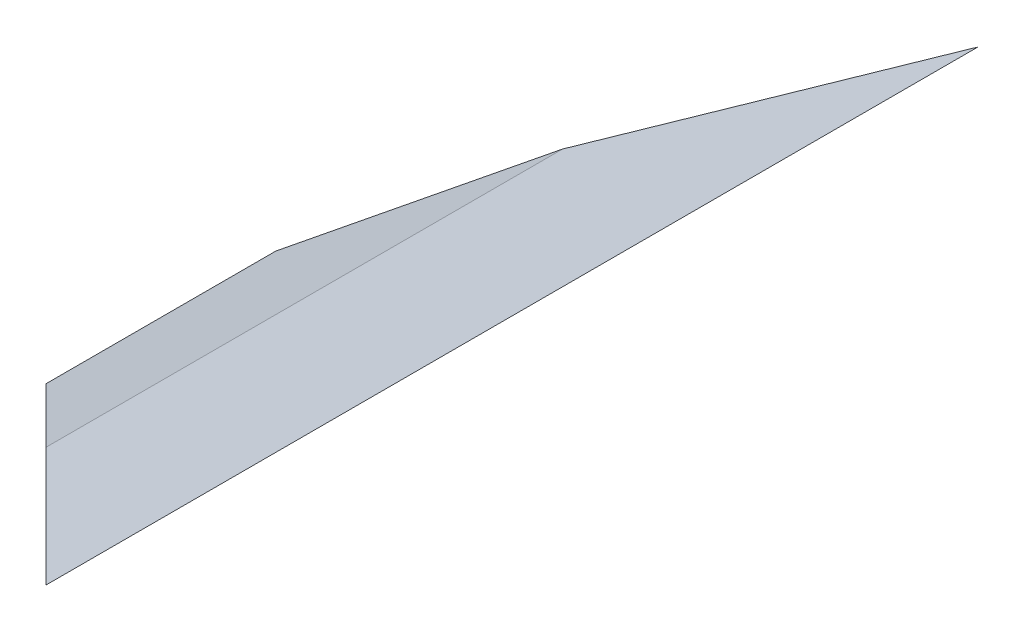
ISO-10303-21;
HEADER;
FILE_DESCRIPTION(('STEP AP214'),'2;1');
FILE_NAME('part.step','',(''),(''),'','','');
FILE_SCHEMA(('AUTOMOTIVE_DESIGN { 1 0 10303 214 1 1 1 1 }'));
ENDSEC;
DATA;
#1=APPLICATION_CONTEXT('core data for automotive mechanical design processes');
#2=APPLICATION_PROTOCOL_DEFINITION('international standard','automotive_design',2000,#1);
#3=PRODUCT_CONTEXT('',#1,'mechanical');
#4=PRODUCT('Part','Part','',(#3));
#5=PRODUCT_RELATED_PRODUCT_CATEGORY('part','',(#4));
#6=PRODUCT_DEFINITION_FORMATION('','',#4);
#7=PRODUCT_DEFINITION_CONTEXT('part definition',#1,'design');
#8=PRODUCT_DEFINITION('design','',#6,#7);
#9=PRODUCT_DEFINITION_SHAPE('','',#8);
#10=(LENGTH_UNIT() NAMED_UNIT(*) SI_UNIT(.MILLI.,.METRE.));
#11=(NAMED_UNIT(*) PLANE_ANGLE_UNIT() SI_UNIT($,.RADIAN.));
#12=(NAMED_UNIT(*) SI_UNIT($,.STERADIAN.) SOLID_ANGLE_UNIT());
#13=UNCERTAINTY_MEASURE_WITH_UNIT(LENGTH_MEASURE(1.E-05),#10,'distance_accuracy_value','');
#14=(GEOMETRIC_REPRESENTATION_CONTEXT(3) GLOBAL_UNCERTAINTY_ASSIGNED_CONTEXT((#13)) GLOBAL_UNIT_ASSIGNED_CONTEXT((#10,
#11,#12)) REPRESENTATION_CONTEXT('',''));
#15=CARTESIAN_POINT('',(0.,0.,0.));
#16=DIRECTION('',(0.,0.,1.));
#17=DIRECTION('',(1.,0.,0.));
#18=AXIS2_PLACEMENT_3D('',#15,#16,#17);
#19=CARTESIAN_POINT('',(-47.5,-0.01,47.5));
#20=DIRECTION('',(0.707106781186547,0.,0.707106781186547));
#21=DIRECTION('',(0.707106781186548,0.,-0.707106781186548));
#22=AXIS2_PLACEMENT_3D('',#19,#20,#21);
#23=PLANE('',#22);
#24=DIRECTION('',(-0.677118157772253,-0.288135386286065,0.677118157772253));
#25=VECTOR('',#24,1.);
#26=CARTESIAN_POINT('',(-47.1283520132835,-1.75674553756744,47.1283520132835));
#27=LINE('',#26,#25);
#28=CARTESIAN_POINT('',(145.,80.,-145.));
#29=VERTEX_POINT('',#28);
#30=CARTESIAN_POINT('',(80.375,52.5,-80.3749999999999));
#31=VERTEX_POINT('',#30);
#32=EDGE_CURVE('E99',#29,#31,#27,.T.);
#33=ORIENTED_EDGE('',*,*,#32,.F.);
#34=DIRECTION('',(0.656785343996412,0.370494296613361,-0.656785343996412));
#35=VECTOR('',#34,1.);
#36=CARTESIAN_POINT('',(47.5,25.,-47.5));
#37=LINE('',#36,#35);
#38=CARTESIAN_POINT('',(47.5,25.,-47.5));
#39=VERTEX_POINT('',#38);
#40=EDGE_CURVE('E112',#39,#29,#37,.T.);
#41=ORIENTED_EDGE('',*,*,#40,.F.);
#42=DIRECTION('',(0.,-1.,0.));
#43=VECTOR('',#42,1.);
#44=CARTESIAN_POINT('',(47.5,25.,-47.5));
#45=LINE('',#44,#43);
#46=CARTESIAN_POINT('',(47.5,0.,-47.5));
#47=VERTEX_POINT('',#46);
#48=EDGE_CURVE('E51',#39,#47,#45,.T.);
#49=ORIENTED_EDGE('',*,*,#48,.T.);
#50=DIRECTION('',(-0.707106781186548,0.,0.707106781186548));
#51=VECTOR('',#50,1.);
#52=CARTESIAN_POINT('',(0.,0.,0.));
#53=LINE('',#52,#51);
#54=CARTESIAN_POINT('',(35.75,0.,-35.75));
#55=VERTEX_POINT('',#54);
#56=EDGE_CURVE('E195',#47,#55,#53,.T.);
#57=ORIENTED_EDGE('',*,*,#56,.T.);
#58=DIRECTION('',(0.,-1.,0.));
#59=VECTOR('',#58,1.);
#60=CARTESIAN_POINT('',(35.75,25.,-35.75));
#61=LINE('',#60,#59);
#62=CARTESIAN_POINT('',(35.75,25.,-35.75));
#63=VERTEX_POINT('',#62);
#64=EDGE_CURVE('E201',#63,#55,#61,.T.);
#65=ORIENTED_EDGE('',*,*,#64,.F.);
#66=DIRECTION('',(0.648236443017991,0.399473438274393,-0.648236443017991));
#67=VECTOR('',#66,1.);
#68=CARTESIAN_POINT('',(35.75,25.,-35.75));
#69=LINE('',#68,#67);
#70=EDGE_CURVE('E114',#63,#31,#69,.T.);
#71=ORIENTED_EDGE('',*,*,#70,.T.);
#72=EDGE_LOOP('',(#33,#41,#49,#57,#65,#71));
#73=FACE_BOUND('',#72,.T.);
#74=ADVANCED_FACE('F40',(#73),#23,.F.);
#75=CARTESIAN_POINT('',(-47.5,-0.01,-47.5));
#76=DIRECTION('',(-0.707106781186547,0.,0.707106781186547));
#77=DIRECTION('',(0.707106781186548,0.,0.707106781186548));
#78=AXIS2_PLACEMENT_3D('',#75,#76,#77);
#79=PLANE('',#78);
#80=DIRECTION('',(0.656785343996412,0.370494296613361,0.656785343996412));
#81=VECTOR('',#80,1.);
#82=CARTESIAN_POINT('',(47.5,25.,47.5));
#83=LINE('',#82,#81);
#84=CARTESIAN_POINT('',(47.5,25.,47.5));
#85=VERTEX_POINT('',#84);
#86=CARTESIAN_POINT('',(145.,80.,145.));
#87=VERTEX_POINT('',#86);
#88=EDGE_CURVE('E107',#85,#87,#83,.T.);
#89=ORIENTED_EDGE('',*,*,#88,.T.);
#90=DIRECTION('',(-0.677118157772253,-0.288135386286065,-0.677118157772253));
#91=VECTOR('',#90,1.);
#92=CARTESIAN_POINT('',(-47.1283520132835,-1.75674553756744,-47.1283520132835));
#93=LINE('',#92,#91);
#94=CARTESIAN_POINT('',(80.375,52.5,80.375));
#95=VERTEX_POINT('',#94);
#96=EDGE_CURVE('E102',#87,#95,#93,.T.);
#97=ORIENTED_EDGE('',*,*,#96,.T.);
#98=DIRECTION('',(0.648236443017992,0.399473438274393,0.648236443017991));
#99=VECTOR('',#98,1.);
#100=CARTESIAN_POINT('',(35.75,25.,35.75));
#101=LINE('',#100,#99);
#102=CARTESIAN_POINT('',(35.75,25.,35.75));
#103=VERTEX_POINT('',#102);
#104=EDGE_CURVE('E119',#103,#95,#101,.T.);
#105=ORIENTED_EDGE('',*,*,#104,.F.);
#106=DIRECTION('',(0.,-1.,0.));
#107=VECTOR('',#106,1.);
#108=CARTESIAN_POINT('',(35.75,25.,35.75));
#109=LINE('',#108,#107);
#110=CARTESIAN_POINT('',(35.75,0.,35.75));
#111=VERTEX_POINT('',#110);
#112=EDGE_CURVE('E12',#103,#111,#109,.T.);
#113=ORIENTED_EDGE('',*,*,#112,.T.);
#114=DIRECTION('',(-0.707106781186548,0.,-0.707106781186548));
#115=VECTOR('',#114,1.);
#116=CARTESIAN_POINT('',(0.,0.,0.));
#117=LINE('',#116,#115);
#118=CARTESIAN_POINT('',(47.5,0.,47.5));
#119=VERTEX_POINT('',#118);
#120=EDGE_CURVE('E192',#119,#111,#117,.T.);
#121=ORIENTED_EDGE('',*,*,#120,.F.);
#122=DIRECTION('',(0.,-1.,0.));
#123=VECTOR('',#122,1.);
#124=CARTESIAN_POINT('',(47.5,25.,47.5));
#125=LINE('',#124,#123);
#126=EDGE_CURVE('E75',#85,#119,#125,.T.);
#127=ORIENTED_EDGE('',*,*,#126,.F.);
#128=EDGE_LOOP('',(#89,#97,#105,#113,#121,#127));
#129=FACE_BOUND('',#128,.T.);
#130=ADVANCED_FACE('F42',(#129),#79,.T.);
#131=CARTESIAN_POINT('',(-1.32613776592417,2.15195992015877,0.));
#132=DIRECTION('',(-0.52462952652083,0.851330640763346,0.));
#133=DIRECTION('',(-0.851330640763346,-0.52462952652083,0.));
#134=AXIS2_PLACEMENT_3D('',#131,#132,#133);
#135=PLANE('',#134);
#136=ORIENTED_EDGE('',*,*,#104,.T.);
#137=DIRECTION('',(0.,0.,1.));
#138=VECTOR('',#137,1.);
#139=CARTESIAN_POINT('',(80.375,52.5,-145.));
#140=LINE('',#139,#138);
#141=EDGE_CURVE('E189',#31,#95,#140,.T.);
#142=ORIENTED_EDGE('',*,*,#141,.F.);
#143=ORIENTED_EDGE('',*,*,#70,.F.);
#144=DIRECTION('',(0.,0.,1.));
#145=VECTOR('',#144,1.);
#146=CARTESIAN_POINT('',(35.75,25.,35.75));
#147=LINE('',#146,#145);
#148=EDGE_CURVE('E190',#103,#63,#147,.F.);
#149=ORIENTED_EDGE('',*,*,#148,.F.);
#150=EDGE_LOOP('',(#136,#142,#143,#149));
#151=FACE_BOUND('',#150,.T.);
#152=ADVANCED_FACE('F146',(#151),#135,.T.);
#153=CARTESIAN_POINT('',(0.,0.,0.));
#154=DIRECTION('',(0.,-1.,0.));
#155=DIRECTION('',(0.,0.,-1.));
#156=AXIS2_PLACEMENT_3D('',#153,#154,#155);
#157=PLANE('',#156);
#158=DIRECTION('',(0.,0.,-1.));
#159=VECTOR('',#158,1.);
#160=CARTESIAN_POINT('',(47.5,0.,47.5));
#161=LINE('',#160,#159);
#162=EDGE_CURVE('E198',#119,#47,#161,.T.);
#163=ORIENTED_EDGE('',*,*,#162,.F.);
#164=ORIENTED_EDGE('',*,*,#120,.T.);
#165=DIRECTION('',(0.,0.,-1.));
#166=VECTOR('',#165,1.);
#167=CARTESIAN_POINT('',(35.75,0.,35.75));
#168=LINE('',#167,#166);
#169=EDGE_CURVE('E205',#111,#55,#168,.T.);
#170=ORIENTED_EDGE('',*,*,#169,.T.);
#171=ORIENTED_EDGE('',*,*,#56,.F.);
#172=EDGE_LOOP('',(#163,#164,#170,#171));
#173=FACE_BOUND('',#172,.T.);
#174=ADVANCED_FACE('F160',(#173),#157,.T.);
#175=CARTESIAN_POINT('',(35.75,25.,35.75));
#176=DIRECTION('',(-1.,0.,0.));
#177=DIRECTION('',(0.,0.,1.));
#178=AXIS2_PLACEMENT_3D('',#175,#176,#177);
#179=PLANE('',#178);
#180=CARTESIAN_POINT('',(35.75,12.5,-10.));
#181=DIRECTION('',(-1.,0.,0.));
#182=DIRECTION('',(0.,0.,1.));
#183=AXIS2_PLACEMENT_3D('',#180,#181,#182);
#184=CIRCLE('',#183,1.5);
#185=CARTESIAN_POINT('',(35.75,12.5,-8.5));
#186=VERTEX_POINT('',#185);
#187=EDGE_CURVE('E211',#186,#186,#184,.T.);
#188=ORIENTED_EDGE('',*,*,#187,.F.);
#189=EDGE_LOOP('',(#188));
#190=FACE_BOUND('',#189,.T.);
#191=CARTESIAN_POINT('',(35.75,12.5,10.));
#192=DIRECTION('',(-1.,0.,0.));
#193=DIRECTION('',(0.,0.,1.));
#194=AXIS2_PLACEMENT_3D('',#191,#192,#193);
#195=CIRCLE('',#194,1.5);
#196=CARTESIAN_POINT('',(35.75,12.5,11.5));
#197=VERTEX_POINT('',#196);
#198=EDGE_CURVE('E213',#197,#197,#195,.T.);
#199=ORIENTED_EDGE('',*,*,#198,.F.);
#200=EDGE_LOOP('',(#199));
#201=FACE_BOUND('',#200,.T.);
#202=CARTESIAN_POINT('',(35.75,12.5,0.));
#203=DIRECTION('',(-1.,0.,0.));
#204=DIRECTION('',(0.,0.,1.));
#205=AXIS2_PLACEMENT_3D('',#202,#203,#204);
#206=CIRCLE('',#205,1.5);
#207=CARTESIAN_POINT('',(35.75,12.5,1.5));
#208=VERTEX_POINT('',#207);
#209=EDGE_CURVE('E216',#208,#208,#206,.T.);
#210=ORIENTED_EDGE('',*,*,#209,.F.);
#211=EDGE_LOOP('',(#210));
#212=FACE_BOUND('',#211,.T.);
#213=ORIENTED_EDGE('',*,*,#169,.F.);
#214=ORIENTED_EDGE('',*,*,#112,.F.);
#215=ORIENTED_EDGE('',*,*,#148,.T.);
#216=ORIENTED_EDGE('',*,*,#64,.T.);
#217=EDGE_LOOP('',(#213,#214,#215,#216));
#218=FACE_BOUND('',#217,.T.);
#219=ADVANCED_FACE('F161',(#190,#201,#212,#218),#179,.T.);
#220=CARTESIAN_POINT('',(47.5,25.,47.5));
#221=DIRECTION('',(-1.,0.,0.));
#222=DIRECTION('',(0.,0.,1.));
#223=AXIS2_PLACEMENT_3D('',#220,#221,#222);
#224=PLANE('',#223);
#225=CARTESIAN_POINT('',(47.5,12.5,-10.));
#226=DIRECTION('',(1.,0.,0.));
#227=DIRECTION('',(0.,0.,-1.));
#228=AXIS2_PLACEMENT_3D('',#225,#226,#227);
#229=CIRCLE('',#228,1.5);
#230=CARTESIAN_POINT('',(47.5,12.5,-11.5));
#231=VERTEX_POINT('',#230);
#232=EDGE_CURVE('E121',#231,#231,#229,.T.);
#233=ORIENTED_EDGE('',*,*,#232,.F.);
#234=EDGE_LOOP('',(#233));
#235=FACE_BOUND('',#234,.T.);
#236=CARTESIAN_POINT('',(47.5,12.5,10.));
#237=DIRECTION('',(1.,0.,0.));
#238=DIRECTION('',(0.,0.,1.));
#239=AXIS2_PLACEMENT_3D('',#236,#237,#238);
#240=CIRCLE('',#239,1.5);
#241=CARTESIAN_POINT('',(47.5,12.5,11.5));
#242=VERTEX_POINT('',#241);
#243=EDGE_CURVE('E224',#242,#242,#240,.T.);
#244=ORIENTED_EDGE('',*,*,#243,.F.);
#245=EDGE_LOOP('',(#244));
#246=FACE_BOUND('',#245,.T.);
#247=CARTESIAN_POINT('',(47.5,12.5,0.));
#248=DIRECTION('',(1.,0.,0.));
#249=DIRECTION('',(0.,0.,-1.));
#250=AXIS2_PLACEMENT_3D('',#247,#248,#249);
#251=CIRCLE('',#250,1.5);
#252=CARTESIAN_POINT('',(47.5,12.5,-1.5));
#253=VERTEX_POINT('',#252);
#254=EDGE_CURVE('E221',#253,#253,#251,.T.);
#255=ORIENTED_EDGE('',*,*,#254,.F.);
#256=EDGE_LOOP('',(#255));
#257=FACE_BOUND('',#256,.T.);
#258=ORIENTED_EDGE('',*,*,#162,.T.);
#259=ORIENTED_EDGE('',*,*,#48,.F.);
#260=DIRECTION('',(0.,0.,1.));
#261=VECTOR('',#260,1.);
#262=CARTESIAN_POINT('',(47.5,25.,0.));
#263=LINE('',#262,#261);
#264=EDGE_CURVE('E118',#85,#39,#263,.F.);
#265=ORIENTED_EDGE('',*,*,#264,.F.);
#266=ORIENTED_EDGE('',*,*,#126,.T.);
#267=EDGE_LOOP('',(#258,#259,#265,#266));
#268=FACE_BOUND('',#267,.T.);
#269=ADVANCED_FACE('F158',(#235,#246,#257,#268),#224,.F.);
#270=CARTESIAN_POINT('',(27.5,12.5,0.));
#271=DIRECTION('',(1.,0.,0.));
#272=DIRECTION('',(0.,0.,-1.));
#273=AXIS2_PLACEMENT_3D('',#270,#271,#272);
#274=CYLINDRICAL_SURFACE('',#273,1.5);
#275=ORIENTED_EDGE('',*,*,#209,.T.);
#276=EDGE_LOOP('',(#275));
#277=FACE_BOUND('',#276,.T.);
#278=ORIENTED_EDGE('',*,*,#254,.T.);
#279=EDGE_LOOP('',(#278));
#280=FACE_BOUND('',#279,.T.);
#281=ADVANCED_FACE('F151',(#277,#280),#274,.F.);
#282=CARTESIAN_POINT('',(27.5,12.5,10.));
#283=DIRECTION('',(1.,0.,0.));
#284=DIRECTION('',(0.,0.,-1.));
#285=AXIS2_PLACEMENT_3D('',#282,#283,#284);
#286=CYLINDRICAL_SURFACE('',#285,1.5);
#287=ORIENTED_EDGE('',*,*,#198,.T.);
#288=EDGE_LOOP('',(#287));
#289=FACE_BOUND('',#288,.T.);
#290=ORIENTED_EDGE('',*,*,#243,.T.);
#291=EDGE_LOOP('',(#290));
#292=FACE_BOUND('',#291,.T.);
#293=ADVANCED_FACE('F148',(#289,#292),#286,.F.);
#294=CARTESIAN_POINT('',(27.5,12.5,-10.));
#295=DIRECTION('',(1.,0.,0.));
#296=DIRECTION('',(0.,0.,-1.));
#297=AXIS2_PLACEMENT_3D('',#294,#295,#296);
#298=CYLINDRICAL_SURFACE('',#297,1.5);
#299=ORIENTED_EDGE('',*,*,#187,.T.);
#300=EDGE_LOOP('',(#299));
#301=FACE_BOUND('',#300,.T.);
#302=ORIENTED_EDGE('',*,*,#232,.T.);
#303=EDGE_LOOP('',(#302));
#304=FACE_BOUND('',#303,.T.);
#305=ADVANCED_FACE('F145',(#301,#304),#298,.F.);
#306=CARTESIAN_POINT('',(0.768079800498757,-1.36159600997507,0.));
#307=DIRECTION('',(0.491321186931909,-0.870978467742929,0.));
#308=DIRECTION('',(0.870978467742929,0.491321186931909,0.));
#309=AXIS2_PLACEMENT_3D('',#306,#307,#308);
#310=PLANE('',#309);
#311=ORIENTED_EDGE('',*,*,#40,.T.);
#312=DIRECTION('',(0.,0.,-1.));
#313=VECTOR('',#312,1.);
#314=CARTESIAN_POINT('',(145.,80.,145.));
#315=LINE('',#314,#313);
#316=EDGE_CURVE('E44',#87,#29,#315,.T.);
#317=ORIENTED_EDGE('',*,*,#316,.F.);
#318=ORIENTED_EDGE('',*,*,#88,.F.);
#319=ORIENTED_EDGE('',*,*,#264,.T.);
#320=EDGE_LOOP('',(#311,#317,#318,#319));
#321=FACE_BOUND('',#320,.T.);
#322=ADVANCED_FACE('F117',(#321),#310,.T.);
#323=CARTESIAN_POINT('',(-6.59256420084324,15.4925258719816,-145.));
#324=DIRECTION('',(-0.391555164097267,0.920154635628578,0.));
#325=DIRECTION('',(-0.920154635628578,-0.391555164097267,0.));
#326=AXIS2_PLACEMENT_3D('',#323,#324,#325);
#327=PLANE('',#326);
#328=ORIENTED_EDGE('',*,*,#32,.T.);
#329=ORIENTED_EDGE('',*,*,#141,.T.);
#330=ORIENTED_EDGE('',*,*,#96,.F.);
#331=ORIENTED_EDGE('',*,*,#316,.T.);
#332=EDGE_LOOP('',(#328,#329,#330,#331));
#333=FACE_BOUND('',#332,.T.);
#334=ADVANCED_FACE('F98',(#333),#327,.T.);
#335=CLOSED_SHELL('',(#74,#130,#152,#174,#219,#269,#281,#293,#305,#322,#334));
#336=MANIFOLD_SOLID_BREP('B2',#335);
#337=ADVANCED_BREP_SHAPE_REPRESENTATION('',(#18,#336),#14);
#338=SHAPE_DEFINITION_REPRESENTATION(#9,#337);
ENDSEC;
END-ISO-10303-21;
